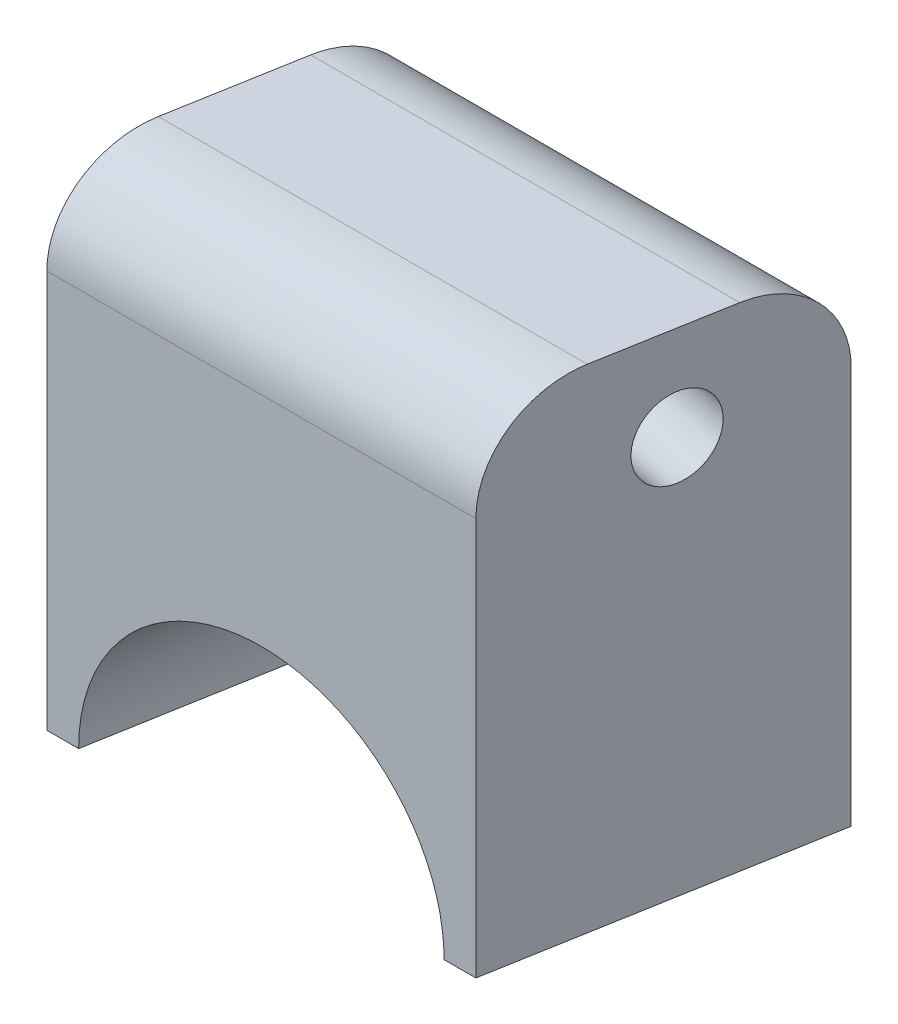
ISO-10303-21;
HEADER;
FILE_DESCRIPTION(('STEP AP214'),'2;1');
FILE_NAME('part.step','',(''),(''),'','','');
FILE_SCHEMA(('AUTOMOTIVE_DESIGN { 1 0 10303 214 1 1 1 1 }'));
ENDSEC;
DATA;
#1=APPLICATION_CONTEXT('core data for automotive mechanical design processes');
#2=APPLICATION_PROTOCOL_DEFINITION('international standard','automotive_design',2000,#1);
#3=PRODUCT_CONTEXT('',#1,'mechanical');
#4=PRODUCT('Part','Part','',(#3));
#5=PRODUCT_RELATED_PRODUCT_CATEGORY('part','',(#4));
#6=PRODUCT_DEFINITION_FORMATION('','',#4);
#7=PRODUCT_DEFINITION_CONTEXT('part definition',#1,'design');
#8=PRODUCT_DEFINITION('design','',#6,#7);
#9=PRODUCT_DEFINITION_SHAPE('','',#8);
#10=(LENGTH_UNIT() NAMED_UNIT(*) SI_UNIT(.MILLI.,.METRE.));
#11=(NAMED_UNIT(*) PLANE_ANGLE_UNIT() SI_UNIT($,.RADIAN.));
#12=(NAMED_UNIT(*) SI_UNIT($,.STERADIAN.) SOLID_ANGLE_UNIT());
#13=UNCERTAINTY_MEASURE_WITH_UNIT(LENGTH_MEASURE(1.E-05),#10,'distance_accuracy_value','');
#14=(GEOMETRIC_REPRESENTATION_CONTEXT(3) GLOBAL_UNCERTAINTY_ASSIGNED_CONTEXT((#13)) GLOBAL_UNIT_ASSIGNED_CONTEXT((#10,
#11,#12)) REPRESENTATION_CONTEXT('',''));
#15=CARTESIAN_POINT('',(0.,0.,0.));
#16=DIRECTION('',(0.,0.,1.));
#17=DIRECTION('',(1.,0.,0.));
#18=AXIS2_PLACEMENT_3D('',#15,#16,#17);
#19=CARTESIAN_POINT('',(0.,0.,0.));
#20=DIRECTION('',(0.,1.,0.));
#21=DIRECTION('',(0.,0.,1.));
#22=AXIS2_PLACEMENT_3D('',#19,#20,#21);
#23=PLANE('',#22);
#24=DIRECTION('',(1.,0.,0.));
#25=VECTOR('',#24,1.);
#26=CARTESIAN_POINT('',(0.,0.,-35.1271880957697));
#27=LINE('',#26,#25);
#28=CARTESIAN_POINT('',(32.2699737521986,0.,-35.1271880957697));
#29=VERTEX_POINT('',#28);
#30=CARTESIAN_POINT('',(33.9459209392839,0.,-35.1271880957697));
#31=VERTEX_POINT('',#30);
#32=EDGE_CURVE('E165',#29,#31,#27,.T.);
#33=ORIENTED_EDGE('',*,*,#32,.T.);
#34=DIRECTION('',(-0.173648177666931,0.,0.984807753012208));
#35=VECTOR('',#34,1.);
#36=CARTESIAN_POINT('',(34.5782152491583,0.,-38.713107320008));
#37=LINE('',#36,#35);
#38=CARTESIAN_POINT('',(30.9765371011794,0.,-18.2869755192609));
#39=VERTEX_POINT('',#38);
#40=EDGE_CURVE('E140',#31,#39,#37,.T.);
#41=ORIENTED_EDGE('',*,*,#40,.T.);
#42=DIRECTION('',(-1.,0.,0.));
#43=VECTOR('',#42,1.);
#44=CARTESIAN_POINT('',(29.300589914094,0.,-18.2869755192609));
#45=LINE('',#44,#43);
#46=CARTESIAN_POINT('',(29.300589914094,0.,-18.2869755192609));
#47=VERTEX_POINT('',#46);
#48=EDGE_CURVE('E150',#39,#47,#45,.T.);
#49=ORIENTED_EDGE('',*,*,#48,.T.);
#50=DIRECTION('',(-0.173648177666934,0.,0.984807753012208));
#51=VECTOR('',#50,1.);
#52=CARTESIAN_POINT('',(25.2898120264757,0.,4.45927619731318));
#53=LINE('',#52,#51);
#54=EDGE_CURVE('E159',#29,#47,#53,.T.);
#55=ORIENTED_EDGE('',*,*,#54,.F.);
#56=EDGE_LOOP('',(#33,#41,#49,#55));
#57=FACE_BOUND('',#56,.T.);
#58=ADVANCED_FACE('F45',(#57),#23,.F.);
#59=CARTESIAN_POINT('',(25.2898120264757,26.,4.45927619731318));
#60=DIRECTION('',(0.984807753012207,0.,0.173648177666934));
#61=DIRECTION('',(0.173648177666934,0.,-0.984807753012207));
#62=AXIS2_PLACEMENT_3D('',#59,#60,#61);
#63=PLANE('',#62);
#64=CARTESIAN_POINT('',(30.7010855725052,21.,-26.2295810852614));
#65=DIRECTION('',(-0.984807753012207,0.,-0.173648177666934));
#66=DIRECTION('',(-0.173648177666934,0.,0.984807753012207));
#67=AXIS2_PLACEMENT_3D('',#64,#65,#66);
#68=CIRCLE('',#67,2.1);
#69=CARTESIAN_POINT('',(30.3364243994046,21.,-24.1614848039358));
#70=VERTEX_POINT('',#69);
#71=EDGE_CURVE('E126',#70,#70,#68,.T.);
#72=ORIENTED_EDGE('',*,*,#71,.F.);
#73=EDGE_LOOP('',(#72));
#74=FACE_BOUND('',#73,.T.);
#75=DIRECTION('',(0.,-1.,0.));
#76=VECTOR('',#75,1.);
#77=CARTESIAN_POINT('',(29.300589914094,26.,-18.2869755192609));
#78=LINE('',#77,#76);
#79=CARTESIAN_POINT('',(29.300589914094,21.,-18.2869755192609));
#80=VERTEX_POINT('',#79);
#81=EDGE_CURVE('E185',#80,#47,#78,.T.);
#82=ORIENTED_EDGE('',*,*,#81,.F.);
#83=CARTESIAN_POINT('',(30.1822248176363,21.,-23.2869755192609));
#84=DIRECTION('',(0.984807753012207,0.,0.173648177666934));
#85=DIRECTION('',(0.173648177666934,0.,-0.984807753012207));
#86=AXIS2_PLACEMENT_3D('',#83,#84,#85);
#87=ELLIPSE('',#86,5.07713305942873,5.);
#88=CARTESIAN_POINT('',(30.1822248176363,26.,-23.2869755192609));
#89=VERTEX_POINT('',#88);
#90=EDGE_CURVE('E199',#80,#89,#87,.F.);
#91=ORIENTED_EDGE('',*,*,#90,.T.);
#92=DIRECTION('',(-0.173648177666934,0.,0.984807753012208));
#93=VECTOR('',#92,1.);
#94=CARTESIAN_POINT('',(25.2898120264757,26.,4.45927619731318));
#95=LINE('',#94,#93);
#96=CARTESIAN_POINT('',(31.3883388486562,26.,-30.1271880957697));
#97=VERTEX_POINT('',#96);
#98=EDGE_CURVE('E160',#97,#89,#95,.T.);
#99=ORIENTED_EDGE('',*,*,#98,.F.);
#100=CARTESIAN_POINT('',(31.3883388486562,21.,-30.1271880957697));
#101=DIRECTION('',(0.984807753012207,0.,0.173648177666934));
#102=DIRECTION('',(0.173648177666934,0.,-0.984807753012207));
#103=AXIS2_PLACEMENT_3D('',#100,#101,#102);
#104=ELLIPSE('',#103,5.07713305942873,5.);
#105=CARTESIAN_POINT('',(32.2699737521986,21.,-35.1271880957697));
#106=VERTEX_POINT('',#105);
#107=EDGE_CURVE('E196',#97,#106,#104,.F.);
#108=ORIENTED_EDGE('',*,*,#107,.T.);
#109=DIRECTION('',(0.,-1.,0.));
#110=VECTOR('',#109,1.);
#111=CARTESIAN_POINT('',(32.2699737521986,26.,-35.1271880957697));
#112=LINE('',#111,#110);
#113=EDGE_CURVE('E168',#106,#29,#112,.T.);
#114=ORIENTED_EDGE('',*,*,#113,.T.);
#115=ORIENTED_EDGE('',*,*,#54,.T.);
#116=EDGE_LOOP('',(#82,#91,#99,#108,#114,#115));
#117=FACE_BOUND('',#116,.T.);
#118=ADVANCED_FACE('F223',(#74,#117),#63,.F.);
#119=CARTESIAN_POINT('',(47.2519817253241,26.,8.33179927011811));
#120=DIRECTION('',(-0.984807753012207,0.,-0.173648177666933));
#121=DIRECTION('',(-0.173648177666933,0.,0.984807753012208));
#122=AXIS2_PLACEMENT_3D('',#119,#120,#121);
#123=PLANE('',#122);
#124=CARTESIAN_POINT('',(53.5374458642941,21.,-27.3148392290808));
#125=DIRECTION('',(0.984807753012208,0.,0.173648177666933));
#126=DIRECTION('',(0.173648177666933,0.,-0.984807753012208));
#127=AXIS2_PLACEMENT_3D('',#124,#125,#126);
#128=CIRCLE('',#127,2.1);
#129=CARTESIAN_POINT('',(53.9021070373947,21.,-29.3829355104065));
#130=VERTEX_POINT('',#129);
#131=EDGE_CURVE('E127',#130,#130,#128,.T.);
#132=ORIENTED_EDGE('',*,*,#131,.F.);
#133=EDGE_LOOP('',(#132));
#134=FACE_BOUND('',#133,.T.);
#135=DIRECTION('',(0.173648177666933,0.,-0.984807753012208));
#136=VECTOR('',#135,1.);
#137=CARTESIAN_POINT('',(47.2519817253241,26.,8.33179927011811));
#138=LINE('',#137,#136);
#139=CARTESIAN_POINT('',(52.8272248176363,26.,-23.2869755192609));
#140=VERTEX_POINT('',#139);
#141=CARTESIAN_POINT('',(54.0333388486562,26.,-30.1271880957697));
#142=VERTEX_POINT('',#141);
#143=EDGE_CURVE('E164',#140,#142,#138,.T.);
#144=ORIENTED_EDGE('',*,*,#143,.F.);
#145=CARTESIAN_POINT('',(52.8272248176363,21.,-23.2869755192609));
#146=DIRECTION('',(-0.984807753012207,0.,-0.173648177666933));
#147=DIRECTION('',(0.173648177666933,0.,-0.984807753012208));
#148=AXIS2_PLACEMENT_3D('',#145,#146,#147);
#149=ELLIPSE('',#148,5.07713305942873,5.);
#150=CARTESIAN_POINT('',(51.945589914094,21.,-18.2869755192609));
#151=VERTEX_POINT('',#150);
#152=EDGE_CURVE('E54',#140,#151,#149,.F.);
#153=ORIENTED_EDGE('',*,*,#152,.T.);
#154=DIRECTION('',(0.,1.,0.));
#155=VECTOR('',#154,1.);
#156=CARTESIAN_POINT('',(51.945589914094,0.,-18.2869755192609));
#157=LINE('',#156,#155);
#158=CARTESIAN_POINT('',(51.945589914094,0.,-18.2869755192609));
#159=VERTEX_POINT('',#158);
#160=EDGE_CURVE('E155',#159,#151,#157,.T.);
#161=ORIENTED_EDGE('',*,*,#160,.F.);
#162=DIRECTION('',(0.173648177666933,0.,-0.984807753012208));
#163=VECTOR('',#162,1.);
#164=CARTESIAN_POINT('',(47.2519817253241,0.,8.33179927011811));
#165=LINE('',#164,#163);
#166=CARTESIAN_POINT('',(54.9149737521986,0.,-35.1271880957697));
#167=VERTEX_POINT('',#166);
#168=EDGE_CURVE('E172',#159,#167,#165,.T.);
#169=ORIENTED_EDGE('',*,*,#168,.T.);
#170=DIRECTION('',(0.,-1.,0.));
#171=VECTOR('',#170,1.);
#172=CARTESIAN_POINT('',(54.9149737521986,26.,-35.1271880957697));
#173=LINE('',#172,#171);
#174=CARTESIAN_POINT('',(54.9149737521986,21.,-35.1271880957697));
#175=VERTEX_POINT('',#174);
#176=EDGE_CURVE('E182',#175,#167,#173,.T.);
#177=ORIENTED_EDGE('',*,*,#176,.F.);
#178=CARTESIAN_POINT('',(54.0333388486562,21.,-30.1271880957697));
#179=DIRECTION('',(-0.984807753012207,0.,-0.173648177666933));
#180=DIRECTION('',(0.173648177666933,0.,-0.984807753012208));
#181=AXIS2_PLACEMENT_3D('',#178,#179,#180);
#182=ELLIPSE('',#181,5.07713305942873,5.);
#183=EDGE_CURVE('E61',#175,#142,#182,.F.);
#184=ORIENTED_EDGE('',*,*,#183,.T.);
#185=EDGE_LOOP('',(#144,#153,#161,#169,#177,#184));
#186=FACE_BOUND('',#185,.T.);
#187=ADVANCED_FACE('F212',(#134,#186),#123,.F.);
#188=CARTESIAN_POINT('',(0.,26.,-35.1271880957697));
#189=DIRECTION('',(0.,0.,-1.));
#190=DIRECTION('',(-1.,0.,0.));
#191=AXIS2_PLACEMENT_3D('',#188,#189,#190);
#192=PLANE('',#191);
#193=ORIENTED_EDGE('',*,*,#113,.F.);
#194=DIRECTION('',(1.,0.,0.));
#195=VECTOR('',#194,1.);
#196=CARTESIAN_POINT('',(0.,21.,-35.1271880957697));
#197=LINE('',#196,#195);
#198=EDGE_CURVE('E11',#106,#175,#197,.T.);
#199=ORIENTED_EDGE('',*,*,#198,.T.);
#200=ORIENTED_EDGE('',*,*,#176,.T.);
#201=CARTESIAN_POINT('',(53.2390265651131,0.,-35.1271880957697));
#202=VERTEX_POINT('',#201);
#203=EDGE_CURVE('E176',#202,#167,#27,.T.);
#204=ORIENTED_EDGE('',*,*,#203,.F.);
#205=CARTESIAN_POINT('',(43.5924737521985,0.,-35.1271880957697));
#206=DIRECTION('',(0.,0.,-1.));
#207=DIRECTION('',(-1.,0.,0.));
#208=AXIS2_PLACEMENT_3D('',#205,#206,#207);
#209=ELLIPSE('',#208,9.64655281291458,9.5);
#210=EDGE_CURVE('E144',#31,#202,#209,.T.);
#211=ORIENTED_EDGE('',*,*,#210,.F.);
#212=ORIENTED_EDGE('',*,*,#32,.F.);
#213=EDGE_LOOP('',(#193,#199,#200,#204,#211,#212));
#214=FACE_BOUND('',#213,.T.);
#215=ADVANCED_FACE('F231',(#214),#192,.T.);
#216=CARTESIAN_POINT('',(0.,26.,0.));
#217=DIRECTION('',(0.,1.,0.));
#218=DIRECTION('',(0.,0.,1.));
#219=AXIS2_PLACEMENT_3D('',#216,#217,#218);
#220=PLANE('',#219);
#221=ORIENTED_EDGE('',*,*,#98,.T.);
#222=DIRECTION('',(-1.,0.,0.));
#223=VECTOR('',#222,1.);
#224=CARTESIAN_POINT('',(51.945589914094,26.,-23.2869755192609));
#225=LINE('',#224,#223);
#226=EDGE_CURVE('E205',#89,#140,#225,.F.);
#227=ORIENTED_EDGE('',*,*,#226,.T.);
#228=ORIENTED_EDGE('',*,*,#143,.T.);
#229=DIRECTION('',(1.,0.,0.));
#230=VECTOR('',#229,1.);
#231=CARTESIAN_POINT('',(0.,26.,-30.1271880957697));
#232=LINE('',#231,#230);
#233=EDGE_CURVE('E202',#142,#97,#232,.F.);
#234=ORIENTED_EDGE('',*,*,#233,.T.);
#235=EDGE_LOOP('',(#221,#227,#228,#234));
#236=FACE_BOUND('',#235,.T.);
#237=ADVANCED_FACE('F226',(#236),#220,.T.);
#238=CARTESIAN_POINT('',(50.2696427270086,0.,-18.2869755192609));
#239=VERTEX_POINT('',#238);
#240=EDGE_CURVE('E151',#159,#239,#45,.T.);
#241=ORIENTED_EDGE('',*,*,#240,.T.);
#242=DIRECTION('',(-0.173648177666931,0.,0.984807753012208));
#243=VECTOR('',#242,1.);
#244=CARTESIAN_POINT('',(53.2895625563903,0.,-35.4137919443363));
#245=LINE('',#244,#243);
#246=EDGE_CURVE('E141',#202,#239,#245,.T.);
#247=ORIENTED_EDGE('',*,*,#246,.F.);
#248=ORIENTED_EDGE('',*,*,#203,.T.);
#249=ORIENTED_EDGE('',*,*,#168,.F.);
#250=EDGE_LOOP('',(#241,#247,#248,#249));
#251=FACE_BOUND('',#250,.T.);
#252=ADVANCED_FACE('F242',(#251),#23,.F.);
#253=CARTESIAN_POINT('',(29.300589914094,0.,-18.2869755192609));
#254=DIRECTION('',(0.,0.,-1.));
#255=DIRECTION('',(-1.,0.,0.));
#256=AXIS2_PLACEMENT_3D('',#253,#254,#255);
#257=PLANE('',#256);
#258=ORIENTED_EDGE('',*,*,#160,.T.);
#259=DIRECTION('',(-1.,0.,0.));
#260=VECTOR('',#259,1.);
#261=CARTESIAN_POINT('',(29.300589914094,21.,-18.2869755192609));
#262=LINE('',#261,#260);
#263=EDGE_CURVE('E192',#151,#80,#262,.T.);
#264=ORIENTED_EDGE('',*,*,#263,.T.);
#265=ORIENTED_EDGE('',*,*,#81,.T.);
#266=ORIENTED_EDGE('',*,*,#48,.F.);
#267=CARTESIAN_POINT('',(40.623089914094,0.,-18.2869755192609));
#268=DIRECTION('',(0.,0.,-1.));
#269=DIRECTION('',(-1.,0.,0.));
#270=AXIS2_PLACEMENT_3D('',#267,#268,#269);
#271=ELLIPSE('',#270,9.64655281291458,9.5);
#272=EDGE_CURVE('E188',#39,#239,#271,.T.);
#273=ORIENTED_EDGE('',*,*,#272,.T.);
#274=ORIENTED_EDGE('',*,*,#240,.F.);
#275=EDGE_LOOP('',(#258,#264,#265,#266,#273,#274));
#276=FACE_BOUND('',#275,.T.);
#277=ADVANCED_FACE('F218',(#276),#257,.F.);
#278=CARTESIAN_POINT('',(43.9338889027743,0.,-37.0634496321721));
#279=DIRECTION('',(-0.173648177666931,0.,0.984807753012208));
#280=DIRECTION('',(0.984807753012208,0.,0.173648177666931));
#281=AXIS2_PLACEMENT_3D('',#278,#279,#280);
#282=CYLINDRICAL_SURFACE('',#281,9.5);
#283=ORIENTED_EDGE('',*,*,#210,.T.);
#284=ORIENTED_EDGE('',*,*,#246,.T.);
#285=ORIENTED_EDGE('',*,*,#272,.F.);
#286=ORIENTED_EDGE('',*,*,#40,.F.);
#287=EDGE_LOOP('',(#283,#284,#285,#286));
#288=FACE_BOUND('',#287,.T.);
#289=ADVANCED_FACE('F244',(#288),#282,.F.);
#290=CARTESIAN_POINT('',(29.300589914094,21.,-23.2869755192609));
#291=DIRECTION('',(1.,0.,0.));
#292=DIRECTION('',(0.,0.,-1.));
#293=AXIS2_PLACEMENT_3D('',#290,#291,#292);
#294=CYLINDRICAL_SURFACE('',#293,5.);
#295=ORIENTED_EDGE('',*,*,#152,.F.);
#296=ORIENTED_EDGE('',*,*,#226,.F.);
#297=ORIENTED_EDGE('',*,*,#90,.F.);
#298=ORIENTED_EDGE('',*,*,#263,.F.);
#299=EDGE_LOOP('',(#295,#296,#297,#298));
#300=FACE_BOUND('',#299,.T.);
#301=ADVANCED_FACE('F220',(#300),#294,.T.);
#302=CARTESIAN_POINT('',(0.,21.,-30.1271880957697));
#303=DIRECTION('',(1.,0.,0.));
#304=DIRECTION('',(0.,0.,-1.));
#305=AXIS2_PLACEMENT_3D('',#302,#303,#304);
#306=CYLINDRICAL_SURFACE('',#305,5.);
#307=ORIENTED_EDGE('',*,*,#107,.F.);
#308=ORIENTED_EDGE('',*,*,#233,.F.);
#309=ORIENTED_EDGE('',*,*,#183,.F.);
#310=ORIENTED_EDGE('',*,*,#198,.F.);
#311=EDGE_LOOP('',(#307,#308,#309,#310));
#312=FACE_BOUND('',#311,.T.);
#313=ADVANCED_FACE('F47',(#312),#306,.T.);
#314=CARTESIAN_POINT('',(35.3672944787725,21.,-25.4068025574643));
#315=DIRECTION('',(-0.984807753012207,0.,-0.173648177666934));
#316=DIRECTION('',(-0.173648177666934,0.,0.984807753012207));
#317=AXIS2_PLACEMENT_3D('',#314,#315,#316);
#318=CONICAL_SURFACE('',#317,2.1,1.02974425867665);
#319=CARTESIAN_POINT('',(36.6099320905784,21.,-25.1876920192598));
#320=VERTEX_POINT('',#319);
#321=VERTEX_LOOP('',#320);
#322=FACE_BOUND('',#321,.T.);
#323=CARTESIAN_POINT('',(35.3672944787725,21.,-25.4068025574643));
#324=DIRECTION('',(-0.984807753012207,0.,-0.173648177666934));
#325=DIRECTION('',(-0.173648177666934,0.,0.984807753012207));
#326=AXIS2_PLACEMENT_3D('',#323,#324,#325);
#327=CIRCLE('',#326,2.1);
#328=CARTESIAN_POINT('',(35.0026333056719,21.,-23.3387062761387));
#329=VERTEX_POINT('',#328);
#330=EDGE_CURVE('E132',#329,#329,#327,.T.);
#331=ORIENTED_EDGE('',*,*,#330,.T.);
#332=EDGE_LOOP('',(#331));
#333=FACE_BOUND('',#332,.T.);
#334=ADVANCED_FACE('F284',(#322,#333),#318,.F.);
#335=CARTESIAN_POINT('',(30.7010855725052,21.,-26.2295810852614));
#336=DIRECTION('',(-0.984807753012207,0.,-0.173648177666934));
#337=DIRECTION('',(-0.173648177666934,0.,0.984807753012207));
#338=AXIS2_PLACEMENT_3D('',#335,#336,#337);
#339=CYLINDRICAL_SURFACE('',#338,2.1);
#340=ORIENTED_EDGE('',*,*,#330,.F.);
#341=EDGE_LOOP('',(#340));
#342=FACE_BOUND('',#341,.T.);
#343=ORIENTED_EDGE('',*,*,#71,.T.);
#344=EDGE_LOOP('',(#343));
#345=FACE_BOUND('',#344,.T.);
#346=ADVANCED_FACE('F119',(#342,#345),#339,.F.);
#347=CARTESIAN_POINT('',(48.8712369580268,21.,-28.1376177568779));
#348=DIRECTION('',(0.984807753012208,0.,0.173648177666933));
#349=DIRECTION('',(0.173648177666933,0.,-0.984807753012208));
#350=AXIS2_PLACEMENT_3D('',#347,#348,#349);
#351=CONICAL_SURFACE('',#350,2.1,1.02974425867665);
#352=CARTESIAN_POINT('',(47.6285993462209,21.,-28.3567282950824));
#353=VERTEX_POINT('',#352);
#354=VERTEX_LOOP('',#353);
#355=FACE_BOUND('',#354,.T.);
#356=CARTESIAN_POINT('',(48.8712369580268,21.,-28.1376177568779));
#357=DIRECTION('',(0.984807753012208,0.,0.173648177666933));
#358=DIRECTION('',(0.173648177666933,0.,-0.984807753012208));
#359=AXIS2_PLACEMENT_3D('',#356,#357,#358);
#360=CIRCLE('',#359,2.1);
#361=CARTESIAN_POINT('',(49.2358981311274,21.,-30.2057140382036));
#362=VERTEX_POINT('',#361);
#363=EDGE_CURVE('E123',#362,#362,#360,.T.);
#364=ORIENTED_EDGE('',*,*,#363,.T.);
#365=EDGE_LOOP('',(#364));
#366=FACE_BOUND('',#365,.T.);
#367=ADVANCED_FACE('F115',(#355,#366),#351,.F.);
#368=CARTESIAN_POINT('',(53.5374458642941,21.,-27.3148392290808));
#369=DIRECTION('',(0.984807753012208,0.,0.173648177666933));
#370=DIRECTION('',(0.173648177666933,0.,-0.984807753012208));
#371=AXIS2_PLACEMENT_3D('',#368,#369,#370);
#372=CYLINDRICAL_SURFACE('',#371,2.1);
#373=ORIENTED_EDGE('',*,*,#363,.F.);
#374=EDGE_LOOP('',(#373));
#375=FACE_BOUND('',#374,.T.);
#376=ORIENTED_EDGE('',*,*,#131,.T.);
#377=EDGE_LOOP('',(#376));
#378=FACE_BOUND('',#377,.T.);
#379=ADVANCED_FACE('F118',(#375,#378),#372,.F.);
#380=CLOSED_SHELL('',(#58,#118,#187,#215,#237,#252,#277,#289,#301,#313,#334,#346,#367,#379));
#381=MANIFOLD_SOLID_BREP('B2',#380);
#382=ADVANCED_BREP_SHAPE_REPRESENTATION('',(#18,#381),#14);
#383=SHAPE_DEFINITION_REPRESENTATION(#9,#382);
ENDSEC;
END-ISO-10303-21;
